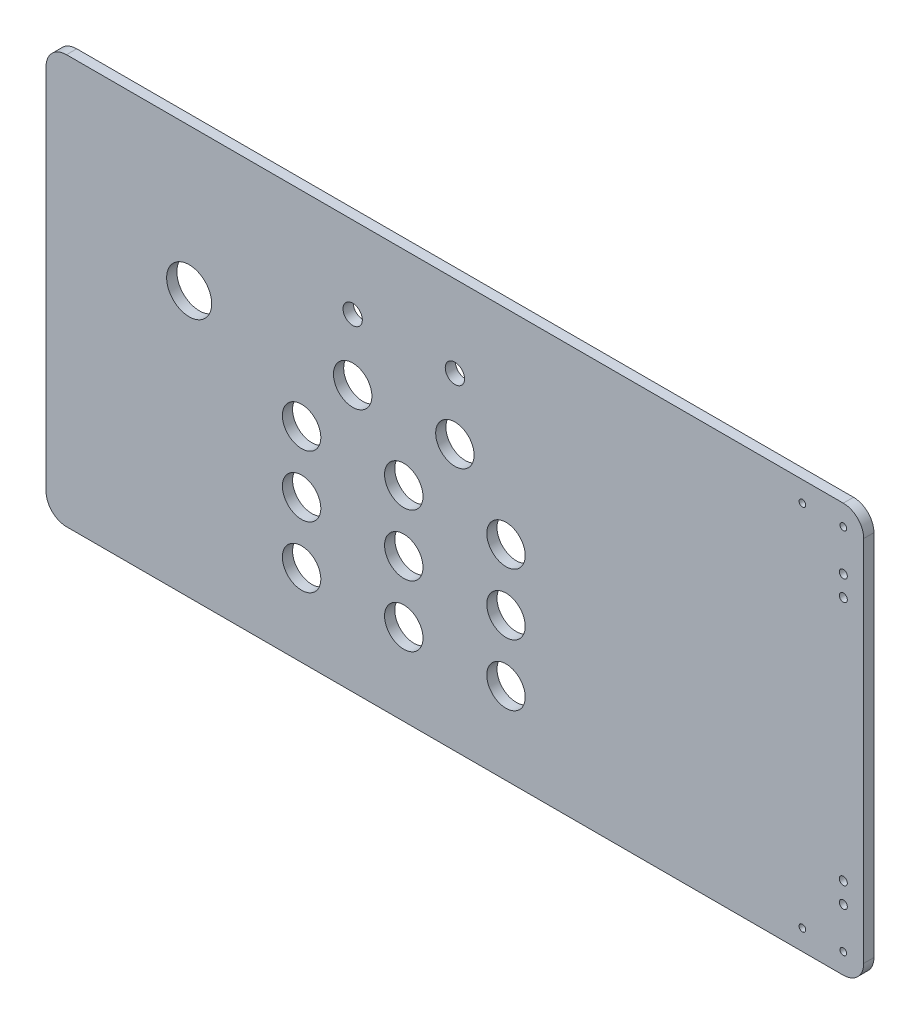
ISO-10303-21;
HEADER;
FILE_DESCRIPTION(('STEP AP214'),'2;1');
FILE_NAME('part.step','',(''),(''),'','','');
FILE_SCHEMA(('AUTOMOTIVE_DESIGN { 1 0 10303 214 1 1 1 1 }'));
ENDSEC;
DATA;
#1=APPLICATION_CONTEXT('core data for automotive mechanical design processes');
#2=APPLICATION_PROTOCOL_DEFINITION('international standard','automotive_design',2000,#1);
#3=PRODUCT_CONTEXT('',#1,'mechanical');
#4=PRODUCT('Part','Part','',(#3));
#5=PRODUCT_RELATED_PRODUCT_CATEGORY('part','',(#4));
#6=PRODUCT_DEFINITION_FORMATION('','',#4);
#7=PRODUCT_DEFINITION_CONTEXT('part definition',#1,'design');
#8=PRODUCT_DEFINITION('design','',#6,#7);
#9=PRODUCT_DEFINITION_SHAPE('','',#8);
#10=(LENGTH_UNIT() NAMED_UNIT(*) SI_UNIT(.MILLI.,.METRE.));
#11=(NAMED_UNIT(*) PLANE_ANGLE_UNIT() SI_UNIT($,.RADIAN.));
#12=(NAMED_UNIT(*) SI_UNIT($,.STERADIAN.) SOLID_ANGLE_UNIT());
#13=UNCERTAINTY_MEASURE_WITH_UNIT(LENGTH_MEASURE(1.E-05),#10,'distance_accuracy_value','');
#14=(GEOMETRIC_REPRESENTATION_CONTEXT(3) GLOBAL_UNCERTAINTY_ASSIGNED_CONTEXT((#13)) GLOBAL_UNIT_ASSIGNED_CONTEXT((#10,
#11,#12)) REPRESENTATION_CONTEXT('',''));
#15=CARTESIAN_POINT('',(0.,0.,0.));
#16=DIRECTION('',(0.,0.,1.));
#17=DIRECTION('',(1.,0.,0.));
#18=AXIS2_PLACEMENT_3D('',#15,#16,#17);
#19=CARTESIAN_POINT('',(0.,0.,6.35));
#20=DIRECTION('',(1.,0.,0.));
#21=DIRECTION('',(0.,1.,0.));
#22=AXIS2_PLACEMENT_3D('',#19,#20,#21);
#23=PLANE('',#22);
#24=DIRECTION('',(0.,-1.,0.));
#25=VECTOR('',#24,1.);
#26=CARTESIAN_POINT('',(0.,0.,0.));
#27=LINE('',#26,#25);
#28=CARTESIAN_POINT('',(-1.0547118733939E-13,241.3,0.));
#29=VERTEX_POINT('',#28);
#30=CARTESIAN_POINT('',(0.,12.7,0.));
#31=VERTEX_POINT('',#30);
#32=EDGE_CURVE('E142',#29,#31,#27,.T.);
#33=ORIENTED_EDGE('',*,*,#32,.T.);
#34=DIRECTION('',(0.,0.,-1.));
#35=VECTOR('',#34,1.);
#36=CARTESIAN_POINT('',(0.,12.7,6.35));
#37=LINE('',#36,#35);
#38=CARTESIAN_POINT('',(0.,12.7,6.35));
#39=VERTEX_POINT('',#38);
#40=EDGE_CURVE('E176',#31,#39,#37,.F.);
#41=ORIENTED_EDGE('',*,*,#40,.T.);
#42=DIRECTION('',(0.,-1.,0.));
#43=VECTOR('',#42,1.);
#44=CARTESIAN_POINT('',(0.,0.,6.35));
#45=LINE('',#44,#43);
#46=CARTESIAN_POINT('',(-1.0547118733939E-13,241.3,6.35));
#47=VERTEX_POINT('',#46);
#48=EDGE_CURVE('E140',#47,#39,#45,.T.);
#49=ORIENTED_EDGE('',*,*,#48,.F.);
#50=DIRECTION('',(0.,0.,-1.));
#51=VECTOR('',#50,1.);
#52=CARTESIAN_POINT('',(-1.0547118733939E-13,241.3,6.35));
#53=LINE('',#52,#51);
#54=EDGE_CURVE('E172',#47,#29,#53,.T.);
#55=ORIENTED_EDGE('',*,*,#54,.T.);
#56=EDGE_LOOP('',(#33,#41,#49,#55));
#57=FACE_BOUND('',#56,.T.);
#58=ADVANCED_FACE('F41',(#57),#23,.F.);
#59=CARTESIAN_POINT('',(0.,0.,6.35));
#60=DIRECTION('',(0.,1.,0.));
#61=DIRECTION('',(0.,0.,1.));
#62=AXIS2_PLACEMENT_3D('',#59,#60,#61);
#63=PLANE('',#62);
#64=DIRECTION('',(1.,0.,0.));
#65=VECTOR('',#64,1.);
#66=CARTESIAN_POINT('',(0.,0.,0.));
#67=LINE('',#66,#65);
#68=CARTESIAN_POINT('',(12.7,0.,0.));
#69=VERTEX_POINT('',#68);
#70=CARTESIAN_POINT('',(495.3,0.,0.));
#71=VERTEX_POINT('',#70);
#72=EDGE_CURVE('E136',#69,#71,#67,.T.);
#73=ORIENTED_EDGE('',*,*,#72,.T.);
#74=DIRECTION('',(0.,0.,-1.));
#75=VECTOR('',#74,1.);
#76=CARTESIAN_POINT('',(495.3,0.,6.35));
#77=LINE('',#76,#75);
#78=CARTESIAN_POINT('',(495.3,0.,6.35));
#79=VERTEX_POINT('',#78);
#80=EDGE_CURVE('E112',#71,#79,#77,.F.);
#81=ORIENTED_EDGE('',*,*,#80,.T.);
#82=DIRECTION('',(1.,0.,0.));
#83=VECTOR('',#82,1.);
#84=CARTESIAN_POINT('',(0.,0.,6.35));
#85=LINE('',#84,#83);
#86=CARTESIAN_POINT('',(12.7,0.,6.35));
#87=VERTEX_POINT('',#86);
#88=EDGE_CURVE('E195',#87,#79,#85,.T.);
#89=ORIENTED_EDGE('',*,*,#88,.F.);
#90=DIRECTION('',(0.,0.,-1.));
#91=VECTOR('',#90,1.);
#92=CARTESIAN_POINT('',(12.7,0.,6.35));
#93=LINE('',#92,#91);
#94=EDGE_CURVE('E118',#87,#69,#93,.T.);
#95=ORIENTED_EDGE('',*,*,#94,.T.);
#96=EDGE_LOOP('',(#73,#81,#89,#95));
#97=FACE_BOUND('',#96,.T.);
#98=ADVANCED_FACE('F448',(#97),#63,.F.);
#99=CARTESIAN_POINT('',(508.,0.,6.35));
#100=DIRECTION('',(-1.,0.,0.));
#101=DIRECTION('',(0.,-1.,0.));
#102=AXIS2_PLACEMENT_3D('',#99,#100,#101);
#103=PLANE('',#102);
#104=DIRECTION('',(0.,1.,0.));
#105=VECTOR('',#104,1.);
#106=CARTESIAN_POINT('',(508.,0.,6.35));
#107=LINE('',#106,#105);
#108=CARTESIAN_POINT('',(508.,12.7,6.35));
#109=VERTEX_POINT('',#108);
#110=CARTESIAN_POINT('',(508.,241.3,6.35));
#111=VERTEX_POINT('',#110);
#112=EDGE_CURVE('E127',#109,#111,#107,.T.);
#113=ORIENTED_EDGE('',*,*,#112,.F.);
#114=DIRECTION('',(0.,0.,-1.));
#115=VECTOR('',#114,1.);
#116=CARTESIAN_POINT('',(508.,12.7,6.35));
#117=LINE('',#116,#115);
#118=CARTESIAN_POINT('',(508.,12.7,0.));
#119=VERTEX_POINT('',#118);
#120=EDGE_CURVE('E111',#109,#119,#117,.T.);
#121=ORIENTED_EDGE('',*,*,#120,.T.);
#122=DIRECTION('',(0.,1.,0.));
#123=VECTOR('',#122,1.);
#124=CARTESIAN_POINT('',(508.,0.,0.));
#125=LINE('',#124,#123);
#126=CARTESIAN_POINT('',(508.,241.3,0.));
#127=VERTEX_POINT('',#126);
#128=EDGE_CURVE('E125',#119,#127,#125,.T.);
#129=ORIENTED_EDGE('',*,*,#128,.T.);
#130=DIRECTION('',(0.,0.,-1.));
#131=VECTOR('',#130,1.);
#132=CARTESIAN_POINT('',(508.,241.3,6.35));
#133=LINE('',#132,#131);
#134=EDGE_CURVE('E130',#127,#111,#133,.F.);
#135=ORIENTED_EDGE('',*,*,#134,.T.);
#136=EDGE_LOOP('',(#113,#121,#129,#135));
#137=FACE_BOUND('',#136,.T.);
#138=ADVANCED_FACE('F124',(#137),#103,.F.);
#139=CARTESIAN_POINT('',(-1.11022302462516E-13,254.,6.35));
#140=DIRECTION('',(0.,-1.,0.));
#141=DIRECTION('',(0.,0.,-1.));
#142=AXIS2_PLACEMENT_3D('',#139,#140,#141);
#143=PLANE('',#142);
#144=DIRECTION('',(-1.,0.,0.));
#145=VECTOR('',#144,1.);
#146=CARTESIAN_POINT('',(-1.11022302462516E-13,254.,0.));
#147=LINE('',#146,#145);
#148=CARTESIAN_POINT('',(495.3,254.,0.));
#149=VERTEX_POINT('',#148);
#150=CARTESIAN_POINT('',(12.6999999999999,254.,0.));
#151=VERTEX_POINT('',#150);
#152=EDGE_CURVE('E135',#149,#151,#147,.T.);
#153=ORIENTED_EDGE('',*,*,#152,.T.);
#154=DIRECTION('',(0.,0.,-1.));
#155=VECTOR('',#154,1.);
#156=CARTESIAN_POINT('',(12.6999999999999,254.,6.35));
#157=LINE('',#156,#155);
#158=CARTESIAN_POINT('',(12.6999999999999,254.,6.35));
#159=VERTEX_POINT('',#158);
#160=EDGE_CURVE('E11',#151,#159,#157,.F.);
#161=ORIENTED_EDGE('',*,*,#160,.T.);
#162=DIRECTION('',(-1.,0.,0.));
#163=VECTOR('',#162,1.);
#164=CARTESIAN_POINT('',(-1.11022302462516E-13,254.,6.35));
#165=LINE('',#164,#163);
#166=CARTESIAN_POINT('',(495.3,254.,6.35));
#167=VERTEX_POINT('',#166);
#168=EDGE_CURVE('E147',#167,#159,#165,.T.);
#169=ORIENTED_EDGE('',*,*,#168,.F.);
#170=DIRECTION('',(0.,0.,-1.));
#171=VECTOR('',#170,1.);
#172=CARTESIAN_POINT('',(495.3,254.,6.35));
#173=LINE('',#172,#171);
#174=EDGE_CURVE('E50',#167,#149,#173,.T.);
#175=ORIENTED_EDGE('',*,*,#174,.T.);
#176=EDGE_LOOP('',(#153,#161,#169,#175));
#177=FACE_BOUND('',#176,.T.);
#178=ADVANCED_FACE('F181',(#177),#143,.F.);
#179=CARTESIAN_POINT('',(0.,0.,6.35));
#180=DIRECTION('',(0.,0.,-1.));
#181=DIRECTION('',(-1.,0.,0.));
#182=AXIS2_PLACEMENT_3D('',#179,#180,#181);
#183=PLANE('',#182);
#184=CARTESIAN_POINT('',(469.920545375963,241.3,6.35));
#185=DIRECTION('',(0.,0.,-1.));
#186=DIRECTION('',(-1.,0.,0.));
#187=AXIS2_PLACEMENT_3D('',#184,#185,#186);
#188=CIRCLE('',#187,2.07010000000004);
#189=CARTESIAN_POINT('',(467.850445375963,241.3,6.35));
#190=VERTEX_POINT('',#189);
#191=EDGE_CURVE('E325',#190,#190,#188,.T.);
#192=ORIENTED_EDGE('',*,*,#191,.T.);
#193=EDGE_LOOP('',(#192));
#194=FACE_BOUND('',#193,.T.);
#195=CARTESIAN_POINT('',(469.920545375963,12.7,6.35));
#196=DIRECTION('',(0.,0.,-1.));
#197=DIRECTION('',(1.,0.,0.));
#198=AXIS2_PLACEMENT_3D('',#195,#196,#197);
#199=CIRCLE('',#198,2.07010000000004);
#200=CARTESIAN_POINT('',(471.990645375963,12.7,6.35));
#201=VERTEX_POINT('',#200);
#202=EDGE_CURVE('E350',#201,#201,#199,.T.);
#203=ORIENTED_EDGE('',*,*,#202,.T.);
#204=EDGE_LOOP('',(#203));
#205=FACE_BOUND('',#204,.T.);
#206=CARTESIAN_POINT('',(495.320545375963,215.9,6.35));
#207=DIRECTION('',(0.,0.,-1.));
#208=DIRECTION('',(-1.,0.,0.));
#209=AXIS2_PLACEMENT_3D('',#206,#207,#208);
#210=CIRCLE('',#209,2.48919999999925);
#211=CARTESIAN_POINT('',(492.831345375963,215.9,6.35));
#212=VERTEX_POINT('',#211);
#213=EDGE_CURVE('E342',#212,#212,#210,.T.);
#214=ORIENTED_EDGE('',*,*,#213,.T.);
#215=EDGE_LOOP('',(#214));
#216=FACE_BOUND('',#215,.T.);
#217=CARTESIAN_POINT('',(495.320545375963,203.2,6.35));
#218=DIRECTION('',(0.,0.,-1.));
#219=DIRECTION('',(-1.,0.,0.));
#220=AXIS2_PLACEMENT_3D('',#217,#218,#219);
#221=CIRCLE('',#220,2.48919999999959);
#222=CARTESIAN_POINT('',(492.831345375963,203.2,6.35));
#223=VERTEX_POINT('',#222);
#224=EDGE_CURVE('E333',#223,#223,#221,.T.);
#225=ORIENTED_EDGE('',*,*,#224,.T.);
#226=EDGE_LOOP('',(#225));
#227=FACE_BOUND('',#226,.T.);
#228=CARTESIAN_POINT('',(495.320545375963,50.7999999999998,6.35));
#229=DIRECTION('',(0.,0.,-1.));
#230=DIRECTION('',(1.,0.,0.));
#231=AXIS2_PLACEMENT_3D('',#228,#229,#230);
#232=CIRCLE('',#231,2.48919999999959);
#233=CARTESIAN_POINT('',(497.809745375962,50.7999999999998,6.35));
#234=VERTEX_POINT('',#233);
#235=EDGE_CURVE('E334',#234,#234,#232,.T.);
#236=ORIENTED_EDGE('',*,*,#235,.T.);
#237=EDGE_LOOP('',(#236));
#238=FACE_BOUND('',#237,.T.);
#239=CARTESIAN_POINT('',(495.320545375963,38.0999999999998,6.35));
#240=DIRECTION('',(0.,0.,-1.));
#241=DIRECTION('',(1.,0.,0.));
#242=AXIS2_PLACEMENT_3D('',#239,#240,#241);
#243=CIRCLE('',#242,2.48919999999925);
#244=CARTESIAN_POINT('',(497.809745375962,38.0999999999998,6.35));
#245=VERTEX_POINT('',#244);
#246=EDGE_CURVE('E373',#245,#245,#243,.T.);
#247=ORIENTED_EDGE('',*,*,#246,.T.);
#248=EDGE_LOOP('',(#247));
#249=FACE_BOUND('',#248,.T.);
#250=CARTESIAN_POINT('',(495.320545375963,12.7,6.35));
#251=DIRECTION('',(0.,0.,-1.));
#252=DIRECTION('',(1.,0.,0.));
#253=AXIS2_PLACEMENT_3D('',#250,#251,#252);
#254=CIRCLE('',#253,2.07010000000004);
#255=CARTESIAN_POINT('',(497.390645375963,12.7,6.35));
#256=VERTEX_POINT('',#255);
#257=EDGE_CURVE('E365',#256,#256,#254,.T.);
#258=ORIENTED_EDGE('',*,*,#257,.T.);
#259=EDGE_LOOP('',(#258));
#260=FACE_BOUND('',#259,.T.);
#261=CARTESIAN_POINT('',(495.320545375963,241.3,6.35));
#262=DIRECTION('',(0.,0.,-1.));
#263=DIRECTION('',(-1.,0.,0.));
#264=AXIS2_PLACEMENT_3D('',#261,#262,#263);
#265=CIRCLE('',#264,2.07010000000004);
#266=CARTESIAN_POINT('',(493.250445375963,241.3,6.35));
#267=VERTEX_POINT('',#266);
#268=EDGE_CURVE('E286',#267,#267,#265,.T.);
#269=ORIENTED_EDGE('',*,*,#268,.T.);
#270=EDGE_LOOP('',(#269));
#271=FACE_BOUND('',#270,.T.);
#272=CARTESIAN_POINT('',(222.25,50.8,6.35));
#273=DIRECTION('',(0.,0.,-1.));
#274=DIRECTION('',(-1.,0.,0.));
#275=AXIS2_PLACEMENT_3D('',#272,#273,#274);
#276=CIRCLE('',#275,11.938);
#277=CARTESIAN_POINT('',(210.312,50.8,6.35));
#278=VERTEX_POINT('',#277);
#279=EDGE_CURVE('E249',#278,#278,#276,.T.);
#280=ORIENTED_EDGE('',*,*,#279,.T.);
#281=EDGE_LOOP('',(#280));
#282=FACE_BOUND('',#281,.T.);
#283=CARTESIAN_POINT('',(158.75,50.8,6.35));
#284=DIRECTION('',(0.,0.,-1.));
#285=DIRECTION('',(-1.,0.,0.));
#286=AXIS2_PLACEMENT_3D('',#283,#284,#285);
#287=CIRCLE('',#286,11.938);
#288=CARTESIAN_POINT('',(146.812,50.8,6.35));
#289=VERTEX_POINT('',#288);
#290=EDGE_CURVE('E258',#289,#289,#287,.T.);
#291=ORIENTED_EDGE('',*,*,#290,.T.);
#292=EDGE_LOOP('',(#291));
#293=FACE_BOUND('',#292,.T.);
#294=CARTESIAN_POINT('',(190.5,165.1,6.35));
#295=DIRECTION('',(0.,0.,-1.));
#296=DIRECTION('',(-1.,0.,0.));
#297=AXIS2_PLACEMENT_3D('',#294,#295,#296);
#298=CIRCLE('',#297,11.938);
#299=CARTESIAN_POINT('',(178.562,165.1,6.35));
#300=VERTEX_POINT('',#299);
#301=EDGE_CURVE('E266',#300,#300,#298,.T.);
#302=ORIENTED_EDGE('',*,*,#301,.T.);
#303=EDGE_LOOP('',(#302));
#304=FACE_BOUND('',#303,.T.);
#305=CARTESIAN_POINT('',(158.75,88.8999999999998,6.35));
#306=DIRECTION('',(0.,0.,-1.));
#307=DIRECTION('',(-1.,0.,0.));
#308=AXIS2_PLACEMENT_3D('',#305,#306,#307);
#309=CIRCLE('',#308,11.938);
#310=CARTESIAN_POINT('',(146.812,88.8999999999998,6.35));
#311=VERTEX_POINT('',#310);
#312=EDGE_CURVE('E274',#311,#311,#309,.T.);
#313=ORIENTED_EDGE('',*,*,#312,.T.);
#314=EDGE_LOOP('',(#313));
#315=FACE_BOUND('',#314,.T.);
#316=CARTESIAN_POINT('',(222.25,88.8999999999998,6.35));
#317=DIRECTION('',(0.,0.,-1.));
#318=DIRECTION('',(-1.,0.,0.));
#319=AXIS2_PLACEMENT_3D('',#316,#317,#318);
#320=CIRCLE('',#319,11.938);
#321=CARTESIAN_POINT('',(210.312,88.8999999999998,6.35));
#322=VERTEX_POINT('',#321);
#323=EDGE_CURVE('E217',#322,#322,#320,.T.);
#324=ORIENTED_EDGE('',*,*,#323,.T.);
#325=EDGE_LOOP('',(#324));
#326=FACE_BOUND('',#325,.T.);
#327=CARTESIAN_POINT('',(254.,165.1,6.35));
#328=DIRECTION('',(0.,0.,-1.));
#329=DIRECTION('',(-1.,0.,0.));
#330=AXIS2_PLACEMENT_3D('',#327,#328,#329);
#331=CIRCLE('',#330,11.938);
#332=CARTESIAN_POINT('',(242.062,165.1,6.35));
#333=VERTEX_POINT('',#332);
#334=EDGE_CURVE('E226',#333,#333,#331,.T.);
#335=ORIENTED_EDGE('',*,*,#334,.T.);
#336=EDGE_LOOP('',(#335));
#337=FACE_BOUND('',#336,.T.);
#338=CARTESIAN_POINT('',(285.75,127.,6.35));
#339=DIRECTION('',(0.,0.,-1.));
#340=DIRECTION('',(-1.,0.,0.));
#341=AXIS2_PLACEMENT_3D('',#338,#339,#340);
#342=CIRCLE('',#341,11.938);
#343=CARTESIAN_POINT('',(273.812,127.,6.35));
#344=VERTEX_POINT('',#343);
#345=EDGE_CURVE('E234',#344,#344,#342,.T.);
#346=ORIENTED_EDGE('',*,*,#345,.T.);
#347=EDGE_LOOP('',(#346));
#348=FACE_BOUND('',#347,.T.);
#349=CARTESIAN_POINT('',(285.75,88.8999999999998,6.35));
#350=DIRECTION('',(0.,0.,-1.));
#351=DIRECTION('',(-1.,0.,0.));
#352=AXIS2_PLACEMENT_3D('',#349,#350,#351);
#353=CIRCLE('',#352,11.938);
#354=CARTESIAN_POINT('',(273.812,88.8999999999998,6.35));
#355=VERTEX_POINT('',#354);
#356=EDGE_CURVE('E242',#355,#355,#353,.T.);
#357=ORIENTED_EDGE('',*,*,#356,.T.);
#358=EDGE_LOOP('',(#357));
#359=FACE_BOUND('',#358,.T.);
#360=CARTESIAN_POINT('',(222.25,127.,6.35));
#361=DIRECTION('',(0.,0.,-1.));
#362=DIRECTION('',(-1.,0.,0.));
#363=AXIS2_PLACEMENT_3D('',#360,#361,#362);
#364=CIRCLE('',#363,11.938);
#365=CARTESIAN_POINT('',(210.312,127.,6.35));
#366=VERTEX_POINT('',#365);
#367=EDGE_CURVE('E314',#366,#366,#364,.T.);
#368=ORIENTED_EDGE('',*,*,#367,.T.);
#369=EDGE_LOOP('',(#368));
#370=FACE_BOUND('',#369,.T.);
#371=CARTESIAN_POINT('',(158.75,127.,6.35));
#372=DIRECTION('',(0.,0.,-1.));
#373=DIRECTION('',(-1.,0.,0.));
#374=AXIS2_PLACEMENT_3D('',#371,#372,#373);
#375=CIRCLE('',#374,11.938);
#376=CARTESIAN_POINT('',(146.812,127.,6.35));
#377=VERTEX_POINT('',#376);
#378=EDGE_CURVE('E306',#377,#377,#375,.T.);
#379=ORIENTED_EDGE('',*,*,#378,.T.);
#380=EDGE_LOOP('',(#379));
#381=FACE_BOUND('',#380,.T.);
#382=CARTESIAN_POINT('',(88.8999999999999,165.1,6.35));
#383=DIRECTION('',(0.,0.,-1.));
#384=DIRECTION('',(-1.,0.,0.));
#385=AXIS2_PLACEMENT_3D('',#382,#383,#384);
#386=CIRCLE('',#385,14.);
#387=CARTESIAN_POINT('',(74.8999999999999,165.1,6.35));
#388=VERTEX_POINT('',#387);
#389=EDGE_CURVE('E298',#388,#388,#386,.T.);
#390=ORIENTED_EDGE('',*,*,#389,.T.);
#391=EDGE_LOOP('',(#390));
#392=FACE_BOUND('',#391,.T.);
#393=CARTESIAN_POINT('',(190.5,203.2,6.35));
#394=DIRECTION('',(0.,0.,-1.));
#395=DIRECTION('',(-1.,0.,0.));
#396=AXIS2_PLACEMENT_3D('',#393,#394,#395);
#397=CIRCLE('',#396,6.00000000000002);
#398=CARTESIAN_POINT('',(184.5,203.2,6.35));
#399=VERTEX_POINT('',#398);
#400=EDGE_CURVE('E290',#399,#399,#397,.T.);
#401=ORIENTED_EDGE('',*,*,#400,.T.);
#402=EDGE_LOOP('',(#401));
#403=FACE_BOUND('',#402,.T.);
#404=CARTESIAN_POINT('',(254.,203.2,6.35));
#405=DIRECTION('',(0.,0.,-1.));
#406=DIRECTION('',(-1.,0.,0.));
#407=AXIS2_PLACEMENT_3D('',#404,#405,#406);
#408=CIRCLE('',#407,6.00000000000002);
#409=CARTESIAN_POINT('',(248.,203.2,6.35));
#410=VERTEX_POINT('',#409);
#411=EDGE_CURVE('E281',#410,#410,#408,.T.);
#412=ORIENTED_EDGE('',*,*,#411,.T.);
#413=EDGE_LOOP('',(#412));
#414=FACE_BOUND('',#413,.T.);
#415=CARTESIAN_POINT('',(285.75,50.8,6.35));
#416=DIRECTION('',(0.,0.,-1.));
#417=DIRECTION('',(-1.,0.,0.));
#418=AXIS2_PLACEMENT_3D('',#415,#416,#417);
#419=CIRCLE('',#418,11.938);
#420=CARTESIAN_POINT('',(273.812,50.8,6.35));
#421=VERTEX_POINT('',#420);
#422=EDGE_CURVE('E208',#421,#421,#419,.T.);
#423=ORIENTED_EDGE('',*,*,#422,.T.);
#424=EDGE_LOOP('',(#423));
#425=FACE_BOUND('',#424,.T.);
#426=ORIENTED_EDGE('',*,*,#88,.T.);
#427=CARTESIAN_POINT('',(495.3,12.7,6.35));
#428=DIRECTION('',(0.,0.,-1.));
#429=DIRECTION('',(-1.,0.,0.));
#430=AXIS2_PLACEMENT_3D('',#427,#428,#429);
#431=CIRCLE('',#430,12.7);
#432=EDGE_CURVE('E169',#79,#109,#431,.F.);
#433=ORIENTED_EDGE('',*,*,#432,.T.);
#434=ORIENTED_EDGE('',*,*,#112,.T.);
#435=CARTESIAN_POINT('',(495.3,241.3,6.35));
#436=DIRECTION('',(0.,0.,-1.));
#437=DIRECTION('',(-1.,0.,0.));
#438=AXIS2_PLACEMENT_3D('',#435,#436,#437);
#439=CIRCLE('',#438,12.7);
#440=EDGE_CURVE('E62',#111,#167,#439,.F.);
#441=ORIENTED_EDGE('',*,*,#440,.T.);
#442=ORIENTED_EDGE('',*,*,#168,.T.);
#443=CARTESIAN_POINT('',(12.6999999999999,241.3,6.35));
#444=DIRECTION('',(0.,0.,-1.));
#445=DIRECTION('',(-1.,0.,0.));
#446=AXIS2_PLACEMENT_3D('',#443,#444,#445);
#447=CIRCLE('',#446,12.7);
#448=EDGE_CURVE('E163',#159,#47,#447,.F.);
#449=ORIENTED_EDGE('',*,*,#448,.T.);
#450=ORIENTED_EDGE('',*,*,#48,.T.);
#451=CARTESIAN_POINT('',(12.7,12.7,6.35));
#452=DIRECTION('',(0.,0.,-1.));
#453=DIRECTION('',(-1.,0.,0.));
#454=AXIS2_PLACEMENT_3D('',#451,#452,#453);
#455=CIRCLE('',#454,12.7);
#456=EDGE_CURVE('E166',#39,#87,#455,.F.);
#457=ORIENTED_EDGE('',*,*,#456,.T.);
#458=EDGE_LOOP('',(#426,#433,#434,#441,#442,#449,#450,#457));
#459=FACE_BOUND('',#458,.T.);
#460=ADVANCED_FACE('F385',(#194,#205,#216,#227,#238,#249,#260,#271,#282,#293,#304,#315,#326,
#337,#348,#359,#370,#381,#392,#403,#414,#425,#459),#183,.F.);
#461=CARTESIAN_POINT('',(0.,0.,0.));
#462=DIRECTION('',(0.,0.,-1.));
#463=DIRECTION('',(-1.,0.,0.));
#464=AXIS2_PLACEMENT_3D('',#461,#462,#463);
#465=PLANE('',#464);
#466=CARTESIAN_POINT('',(469.920545375963,241.3,0.));
#467=DIRECTION('',(0.,0.,-1.));
#468=DIRECTION('',(-1.,0.,0.));
#469=AXIS2_PLACEMENT_3D('',#466,#467,#468);
#470=CIRCLE('',#469,2.07010000000004);
#471=CARTESIAN_POINT('',(467.850445375963,241.3,0.));
#472=VERTEX_POINT('',#471);
#473=EDGE_CURVE('E354',#472,#472,#470,.T.);
#474=ORIENTED_EDGE('',*,*,#473,.F.);
#475=EDGE_LOOP('',(#474));
#476=FACE_BOUND('',#475,.T.);
#477=CARTESIAN_POINT('',(469.920545375963,12.7,0.));
#478=DIRECTION('',(0.,0.,-1.));
#479=DIRECTION('',(1.,0.,0.));
#480=AXIS2_PLACEMENT_3D('',#477,#478,#479);
#481=CIRCLE('',#480,2.07010000000004);
#482=CARTESIAN_POINT('',(471.990645375963,12.7,0.));
#483=VERTEX_POINT('',#482);
#484=EDGE_CURVE('E346',#483,#483,#481,.T.);
#485=ORIENTED_EDGE('',*,*,#484,.F.);
#486=EDGE_LOOP('',(#485));
#487=FACE_BOUND('',#486,.T.);
#488=CARTESIAN_POINT('',(495.320545375963,215.9,0.));
#489=DIRECTION('',(0.,0.,-1.));
#490=DIRECTION('',(-1.,0.,0.));
#491=AXIS2_PLACEMENT_3D('',#488,#489,#490);
#492=CIRCLE('',#491,2.48919999999925);
#493=CARTESIAN_POINT('',(492.831345375963,215.9,0.));
#494=VERTEX_POINT('',#493);
#495=EDGE_CURVE('E338',#494,#494,#492,.T.);
#496=ORIENTED_EDGE('',*,*,#495,.F.);
#497=EDGE_LOOP('',(#496));
#498=FACE_BOUND('',#497,.T.);
#499=CARTESIAN_POINT('',(495.320545375963,203.2,0.));
#500=DIRECTION('',(0.,0.,-1.));
#501=DIRECTION('',(-1.,0.,0.));
#502=AXIS2_PLACEMENT_3D('',#499,#500,#501);
#503=CIRCLE('',#502,2.48919999999959);
#504=CARTESIAN_POINT('',(492.831345375963,203.2,0.));
#505=VERTEX_POINT('',#504);
#506=EDGE_CURVE('E329',#505,#505,#503,.T.);
#507=ORIENTED_EDGE('',*,*,#506,.F.);
#508=EDGE_LOOP('',(#507));
#509=FACE_BOUND('',#508,.T.);
#510=CARTESIAN_POINT('',(495.320545375963,50.7999999999998,0.));
#511=DIRECTION('',(0.,0.,-1.));
#512=DIRECTION('',(1.,0.,0.));
#513=AXIS2_PLACEMENT_3D('',#510,#511,#512);
#514=CIRCLE('',#513,2.48919999999959);
#515=CARTESIAN_POINT('',(497.809745375962,50.7999999999998,0.));
#516=VERTEX_POINT('',#515);
#517=EDGE_CURVE('E377',#516,#516,#514,.T.);
#518=ORIENTED_EDGE('',*,*,#517,.F.);
#519=EDGE_LOOP('',(#518));
#520=FACE_BOUND('',#519,.T.);
#521=CARTESIAN_POINT('',(495.320545375963,38.0999999999998,0.));
#522=DIRECTION('',(0.,0.,-1.));
#523=DIRECTION('',(1.,0.,0.));
#524=AXIS2_PLACEMENT_3D('',#521,#522,#523);
#525=CIRCLE('',#524,2.48919999999925);
#526=CARTESIAN_POINT('',(497.809745375962,38.0999999999998,0.));
#527=VERTEX_POINT('',#526);
#528=EDGE_CURVE('E369',#527,#527,#525,.T.);
#529=ORIENTED_EDGE('',*,*,#528,.F.);
#530=EDGE_LOOP('',(#529));
#531=FACE_BOUND('',#530,.T.);
#532=CARTESIAN_POINT('',(495.320545375963,12.7,0.));
#533=DIRECTION('',(0.,0.,-1.));
#534=DIRECTION('',(1.,0.,0.));
#535=AXIS2_PLACEMENT_3D('',#532,#533,#534);
#536=CIRCLE('',#535,2.07010000000004);
#537=CARTESIAN_POINT('',(497.390645375963,12.7,0.));
#538=VERTEX_POINT('',#537);
#539=EDGE_CURVE('E361',#538,#538,#536,.T.);
#540=ORIENTED_EDGE('',*,*,#539,.F.);
#541=EDGE_LOOP('',(#540));
#542=FACE_BOUND('',#541,.T.);
#543=CARTESIAN_POINT('',(495.320545375963,241.3,0.));
#544=DIRECTION('',(0.,0.,-1.));
#545=DIRECTION('',(-1.,0.,0.));
#546=AXIS2_PLACEMENT_3D('',#543,#544,#545);
#547=CIRCLE('',#546,2.07010000000004);
#548=CARTESIAN_POINT('',(493.250445375963,241.3,0.));
#549=VERTEX_POINT('',#548);
#550=EDGE_CURVE('E321',#549,#549,#547,.T.);
#551=ORIENTED_EDGE('',*,*,#550,.F.);
#552=EDGE_LOOP('',(#551));
#553=FACE_BOUND('',#552,.T.);
#554=CARTESIAN_POINT('',(222.25,50.8,0.));
#555=DIRECTION('',(0.,0.,-1.));
#556=DIRECTION('',(-1.,0.,0.));
#557=AXIS2_PLACEMENT_3D('',#554,#555,#556);
#558=CIRCLE('',#557,11.938);
#559=CARTESIAN_POINT('',(210.312,50.8,0.));
#560=VERTEX_POINT('',#559);
#561=EDGE_CURVE('E253',#560,#560,#558,.T.);
#562=ORIENTED_EDGE('',*,*,#561,.F.);
#563=EDGE_LOOP('',(#562));
#564=FACE_BOUND('',#563,.T.);
#565=CARTESIAN_POINT('',(158.75,50.8,0.));
#566=DIRECTION('',(0.,0.,-1.));
#567=DIRECTION('',(-1.,0.,0.));
#568=AXIS2_PLACEMENT_3D('',#565,#566,#567);
#569=CIRCLE('',#568,11.938);
#570=CARTESIAN_POINT('',(146.812,50.8,0.));
#571=VERTEX_POINT('',#570);
#572=EDGE_CURVE('E262',#571,#571,#569,.T.);
#573=ORIENTED_EDGE('',*,*,#572,.F.);
#574=EDGE_LOOP('',(#573));
#575=FACE_BOUND('',#574,.T.);
#576=CARTESIAN_POINT('',(190.5,165.1,0.));
#577=DIRECTION('',(0.,0.,-1.));
#578=DIRECTION('',(-1.,0.,0.));
#579=AXIS2_PLACEMENT_3D('',#576,#577,#578);
#580=CIRCLE('',#579,11.938);
#581=CARTESIAN_POINT('',(178.562,165.1,0.));
#582=VERTEX_POINT('',#581);
#583=EDGE_CURVE('E270',#582,#582,#580,.T.);
#584=ORIENTED_EDGE('',*,*,#583,.F.);
#585=EDGE_LOOP('',(#584));
#586=FACE_BOUND('',#585,.T.);
#587=CARTESIAN_POINT('',(158.75,88.8999999999998,0.));
#588=DIRECTION('',(0.,0.,-1.));
#589=DIRECTION('',(-1.,0.,0.));
#590=AXIS2_PLACEMENT_3D('',#587,#588,#589);
#591=CIRCLE('',#590,11.938);
#592=CARTESIAN_POINT('',(146.812,88.8999999999998,0.));
#593=VERTEX_POINT('',#592);
#594=EDGE_CURVE('E222',#593,#593,#591,.T.);
#595=ORIENTED_EDGE('',*,*,#594,.F.);
#596=EDGE_LOOP('',(#595));
#597=FACE_BOUND('',#596,.T.);
#598=CARTESIAN_POINT('',(222.25,88.8999999999998,0.));
#599=DIRECTION('',(0.,0.,-1.));
#600=DIRECTION('',(-1.,0.,0.));
#601=AXIS2_PLACEMENT_3D('',#598,#599,#600);
#602=CIRCLE('',#601,11.938);
#603=CARTESIAN_POINT('',(210.312,88.8999999999998,0.));
#604=VERTEX_POINT('',#603);
#605=EDGE_CURVE('E221',#604,#604,#602,.T.);
#606=ORIENTED_EDGE('',*,*,#605,.F.);
#607=EDGE_LOOP('',(#606));
#608=FACE_BOUND('',#607,.T.);
#609=CARTESIAN_POINT('',(254.,165.1,0.));
#610=DIRECTION('',(0.,0.,-1.));
#611=DIRECTION('',(-1.,0.,0.));
#612=AXIS2_PLACEMENT_3D('',#609,#610,#611);
#613=CIRCLE('',#612,11.938);
#614=CARTESIAN_POINT('',(242.062,165.1,0.));
#615=VERTEX_POINT('',#614);
#616=EDGE_CURVE('E230',#615,#615,#613,.T.);
#617=ORIENTED_EDGE('',*,*,#616,.F.);
#618=EDGE_LOOP('',(#617));
#619=FACE_BOUND('',#618,.T.);
#620=CARTESIAN_POINT('',(285.75,127.,0.));
#621=DIRECTION('',(0.,0.,-1.));
#622=DIRECTION('',(-1.,0.,0.));
#623=AXIS2_PLACEMENT_3D('',#620,#621,#622);
#624=CIRCLE('',#623,11.938);
#625=CARTESIAN_POINT('',(273.812,127.,0.));
#626=VERTEX_POINT('',#625);
#627=EDGE_CURVE('E238',#626,#626,#624,.T.);
#628=ORIENTED_EDGE('',*,*,#627,.F.);
#629=EDGE_LOOP('',(#628));
#630=FACE_BOUND('',#629,.T.);
#631=CARTESIAN_POINT('',(285.75,88.8999999999998,0.));
#632=DIRECTION('',(0.,0.,-1.));
#633=DIRECTION('',(-1.,0.,0.));
#634=AXIS2_PLACEMENT_3D('',#631,#632,#633);
#635=CIRCLE('',#634,11.938);
#636=CARTESIAN_POINT('',(273.812,88.8999999999998,0.));
#637=VERTEX_POINT('',#636);
#638=EDGE_CURVE('E215',#637,#637,#635,.T.);
#639=ORIENTED_EDGE('',*,*,#638,.F.);
#640=EDGE_LOOP('',(#639));
#641=FACE_BOUND('',#640,.T.);
#642=CARTESIAN_POINT('',(222.25,127.,0.));
#643=DIRECTION('',(0.,0.,-1.));
#644=DIRECTION('',(-1.,0.,0.));
#645=AXIS2_PLACEMENT_3D('',#642,#643,#644);
#646=CIRCLE('',#645,11.938);
#647=CARTESIAN_POINT('',(210.312,127.,0.));
#648=VERTEX_POINT('',#647);
#649=EDGE_CURVE('E254',#648,#648,#646,.T.);
#650=ORIENTED_EDGE('',*,*,#649,.F.);
#651=EDGE_LOOP('',(#650));
#652=FACE_BOUND('',#651,.T.);
#653=CARTESIAN_POINT('',(158.75,127.,0.));
#654=DIRECTION('',(0.,0.,-1.));
#655=DIRECTION('',(-1.,0.,0.));
#656=AXIS2_PLACEMENT_3D('',#653,#654,#655);
#657=CIRCLE('',#656,11.938);
#658=CARTESIAN_POINT('',(146.812,127.,0.));
#659=VERTEX_POINT('',#658);
#660=EDGE_CURVE('E310',#659,#659,#657,.T.);
#661=ORIENTED_EDGE('',*,*,#660,.F.);
#662=EDGE_LOOP('',(#661));
#663=FACE_BOUND('',#662,.T.);
#664=CARTESIAN_POINT('',(88.8999999999999,165.1,0.));
#665=DIRECTION('',(0.,0.,-1.));
#666=DIRECTION('',(-1.,0.,0.));
#667=AXIS2_PLACEMENT_3D('',#664,#665,#666);
#668=CIRCLE('',#667,14.);
#669=CARTESIAN_POINT('',(74.8999999999999,165.1,0.));
#670=VERTEX_POINT('',#669);
#671=EDGE_CURVE('E302',#670,#670,#668,.T.);
#672=ORIENTED_EDGE('',*,*,#671,.F.);
#673=EDGE_LOOP('',(#672));
#674=FACE_BOUND('',#673,.T.);
#675=CARTESIAN_POINT('',(190.5,203.2,0.));
#676=DIRECTION('',(0.,0.,-1.));
#677=DIRECTION('',(-1.,0.,0.));
#678=AXIS2_PLACEMENT_3D('',#675,#676,#677);
#679=CIRCLE('',#678,6.00000000000002);
#680=CARTESIAN_POINT('',(184.5,203.2,0.));
#681=VERTEX_POINT('',#680);
#682=EDGE_CURVE('E294',#681,#681,#679,.T.);
#683=ORIENTED_EDGE('',*,*,#682,.F.);
#684=EDGE_LOOP('',(#683));
#685=FACE_BOUND('',#684,.T.);
#686=CARTESIAN_POINT('',(254.,203.2,0.));
#687=DIRECTION('',(0.,0.,-1.));
#688=DIRECTION('',(-1.,0.,0.));
#689=AXIS2_PLACEMENT_3D('',#686,#687,#688);
#690=CIRCLE('',#689,6.00000000000002);
#691=CARTESIAN_POINT('',(248.,203.2,0.));
#692=VERTEX_POINT('',#691);
#693=EDGE_CURVE('E285',#692,#692,#690,.T.);
#694=ORIENTED_EDGE('',*,*,#693,.F.);
#695=EDGE_LOOP('',(#694));
#696=FACE_BOUND('',#695,.T.);
#697=CARTESIAN_POINT('',(285.75,50.8,0.));
#698=DIRECTION('',(0.,0.,-1.));
#699=DIRECTION('',(-1.,0.,0.));
#700=AXIS2_PLACEMENT_3D('',#697,#698,#699);
#701=CIRCLE('',#700,11.938);
#702=CARTESIAN_POINT('',(273.812,50.8,0.));
#703=VERTEX_POINT('',#702);
#704=EDGE_CURVE('E201',#703,#703,#701,.T.);
#705=ORIENTED_EDGE('',*,*,#704,.F.);
#706=EDGE_LOOP('',(#705));
#707=FACE_BOUND('',#706,.T.);
#708=ORIENTED_EDGE('',*,*,#128,.F.);
#709=CARTESIAN_POINT('',(495.3,12.7,0.));
#710=DIRECTION('',(0.,0.,-1.));
#711=DIRECTION('',(-1.,0.,0.));
#712=AXIS2_PLACEMENT_3D('',#709,#710,#711);
#713=CIRCLE('',#712,12.7);
#714=EDGE_CURVE('E107',#119,#71,#713,.T.);
#715=ORIENTED_EDGE('',*,*,#714,.T.);
#716=ORIENTED_EDGE('',*,*,#72,.F.);
#717=CARTESIAN_POINT('',(12.7,12.7,0.));
#718=DIRECTION('',(0.,0.,-1.));
#719=DIRECTION('',(-1.,0.,0.));
#720=AXIS2_PLACEMENT_3D('',#717,#718,#719);
#721=CIRCLE('',#720,12.7);
#722=EDGE_CURVE('E119',#69,#31,#721,.T.);
#723=ORIENTED_EDGE('',*,*,#722,.T.);
#724=ORIENTED_EDGE('',*,*,#32,.F.);
#725=CARTESIAN_POINT('',(12.6999999999999,241.3,0.));
#726=DIRECTION('',(0.,0.,-1.));
#727=DIRECTION('',(-1.,0.,0.));
#728=AXIS2_PLACEMENT_3D('',#725,#726,#727);
#729=CIRCLE('',#728,12.7);
#730=EDGE_CURVE('E151',#29,#151,#729,.T.);
#731=ORIENTED_EDGE('',*,*,#730,.T.);
#732=ORIENTED_EDGE('',*,*,#152,.F.);
#733=CARTESIAN_POINT('',(495.3,241.3,0.));
#734=DIRECTION('',(0.,0.,-1.));
#735=DIRECTION('',(-1.,0.,0.));
#736=AXIS2_PLACEMENT_3D('',#733,#734,#735);
#737=CIRCLE('',#736,12.7);
#738=EDGE_CURVE('E129',#149,#127,#737,.T.);
#739=ORIENTED_EDGE('',*,*,#738,.T.);
#740=EDGE_LOOP('',(#708,#715,#716,#723,#724,#731,#732,#739));
#741=FACE_BOUND('',#740,.T.);
#742=ADVANCED_FACE('F132',(#476,#487,#498,#509,#520,#531,#542,#553,#564,#575,#586,#597,#608,
#619,#630,#641,#652,#663,#674,#685,#696,#707,#741),#465,.T.);
#743=CARTESIAN_POINT('',(285.75,50.8,6.35));
#744=DIRECTION('',(0.,0.,-1.));
#745=DIRECTION('',(-1.,0.,0.));
#746=AXIS2_PLACEMENT_3D('',#743,#744,#745);
#747=CYLINDRICAL_SURFACE('',#746,11.938);
#748=ORIENTED_EDGE('',*,*,#422,.F.);
#749=EDGE_LOOP('',(#748));
#750=FACE_BOUND('',#749,.T.);
#751=ORIENTED_EDGE('',*,*,#704,.T.);
#752=EDGE_LOOP('',(#751));
#753=FACE_BOUND('',#752,.T.);
#754=ADVANCED_FACE('F398',(#750,#753),#747,.F.);
#755=CARTESIAN_POINT('',(254.,203.2,6.35));
#756=DIRECTION('',(0.,0.,-1.));
#757=DIRECTION('',(-1.,0.,0.));
#758=AXIS2_PLACEMENT_3D('',#755,#756,#757);
#759=CYLINDRICAL_SURFACE('',#758,6.00000000000002);
#760=ORIENTED_EDGE('',*,*,#411,.F.);
#761=EDGE_LOOP('',(#760));
#762=FACE_BOUND('',#761,.T.);
#763=ORIENTED_EDGE('',*,*,#693,.T.);
#764=EDGE_LOOP('',(#763));
#765=FACE_BOUND('',#764,.T.);
#766=ADVANCED_FACE('F436',(#762,#765),#759,.F.);
#767=CARTESIAN_POINT('',(190.5,203.2,6.35));
#768=DIRECTION('',(0.,0.,-1.));
#769=DIRECTION('',(-1.,0.,0.));
#770=AXIS2_PLACEMENT_3D('',#767,#768,#769);
#771=CYLINDRICAL_SURFACE('',#770,6.00000000000002);
#772=ORIENTED_EDGE('',*,*,#400,.F.);
#773=EDGE_LOOP('',(#772));
#774=FACE_BOUND('',#773,.T.);
#775=ORIENTED_EDGE('',*,*,#682,.T.);
#776=EDGE_LOOP('',(#775));
#777=FACE_BOUND('',#776,.T.);
#778=ADVANCED_FACE('F442',(#774,#777),#771,.F.);
#779=CARTESIAN_POINT('',(88.8999999999999,165.1,6.35));
#780=DIRECTION('',(0.,0.,-1.));
#781=DIRECTION('',(-1.,0.,0.));
#782=AXIS2_PLACEMENT_3D('',#779,#780,#781);
#783=CYLINDRICAL_SURFACE('',#782,14.);
#784=ORIENTED_EDGE('',*,*,#389,.F.);
#785=EDGE_LOOP('',(#784));
#786=FACE_BOUND('',#785,.T.);
#787=ORIENTED_EDGE('',*,*,#671,.T.);
#788=EDGE_LOOP('',(#787));
#789=FACE_BOUND('',#788,.T.);
#790=ADVANCED_FACE('F609',(#786,#789),#783,.F.);
#791=CARTESIAN_POINT('',(158.75,127.,6.35));
#792=DIRECTION('',(0.,0.,-1.));
#793=DIRECTION('',(-1.,0.,0.));
#794=AXIS2_PLACEMENT_3D('',#791,#792,#793);
#795=CYLINDRICAL_SURFACE('',#794,11.938);
#796=ORIENTED_EDGE('',*,*,#378,.F.);
#797=EDGE_LOOP('',(#796));
#798=FACE_BOUND('',#797,.T.);
#799=ORIENTED_EDGE('',*,*,#660,.T.);
#800=EDGE_LOOP('',(#799));
#801=FACE_BOUND('',#800,.T.);
#802=ADVANCED_FACE('F605',(#798,#801),#795,.F.);
#803=CARTESIAN_POINT('',(222.25,127.,6.35));
#804=DIRECTION('',(0.,0.,-1.));
#805=DIRECTION('',(-1.,0.,0.));
#806=AXIS2_PLACEMENT_3D('',#803,#804,#805);
#807=CYLINDRICAL_SURFACE('',#806,11.938);
#808=ORIENTED_EDGE('',*,*,#367,.F.);
#809=EDGE_LOOP('',(#808));
#810=FACE_BOUND('',#809,.T.);
#811=ORIENTED_EDGE('',*,*,#649,.T.);
#812=EDGE_LOOP('',(#811));
#813=FACE_BOUND('',#812,.T.);
#814=ADVANCED_FACE('F601',(#810,#813),#807,.F.);
#815=CARTESIAN_POINT('',(285.75,88.8999999999998,6.35));
#816=DIRECTION('',(0.,0.,-1.));
#817=DIRECTION('',(-1.,0.,0.));
#818=AXIS2_PLACEMENT_3D('',#815,#816,#817);
#819=CYLINDRICAL_SURFACE('',#818,11.938);
#820=ORIENTED_EDGE('',*,*,#356,.F.);
#821=EDGE_LOOP('',(#820));
#822=FACE_BOUND('',#821,.T.);
#823=ORIENTED_EDGE('',*,*,#638,.T.);
#824=EDGE_LOOP('',(#823));
#825=FACE_BOUND('',#824,.T.);
#826=ADVANCED_FACE('F604',(#822,#825),#819,.F.);
#827=CARTESIAN_POINT('',(285.75,127.,6.35));
#828=DIRECTION('',(0.,0.,-1.));
#829=DIRECTION('',(-1.,0.,0.));
#830=AXIS2_PLACEMENT_3D('',#827,#828,#829);
#831=CYLINDRICAL_SURFACE('',#830,11.938);
#832=ORIENTED_EDGE('',*,*,#345,.F.);
#833=EDGE_LOOP('',(#832));
#834=FACE_BOUND('',#833,.T.);
#835=ORIENTED_EDGE('',*,*,#627,.T.);
#836=EDGE_LOOP('',(#835));
#837=FACE_BOUND('',#836,.T.);
#838=ADVANCED_FACE('F634',(#834,#837),#831,.F.);
#839=CARTESIAN_POINT('',(254.,165.1,6.35));
#840=DIRECTION('',(0.,0.,-1.));
#841=DIRECTION('',(-1.,0.,0.));
#842=AXIS2_PLACEMENT_3D('',#839,#840,#841);
#843=CYLINDRICAL_SURFACE('',#842,11.938);
#844=ORIENTED_EDGE('',*,*,#334,.F.);
#845=EDGE_LOOP('',(#844));
#846=FACE_BOUND('',#845,.T.);
#847=ORIENTED_EDGE('',*,*,#616,.T.);
#848=EDGE_LOOP('',(#847));
#849=FACE_BOUND('',#848,.T.);
#850=ADVANCED_FACE('F638',(#846,#849),#843,.F.);
#851=CARTESIAN_POINT('',(222.25,88.8999999999998,6.35));
#852=DIRECTION('',(0.,0.,-1.));
#853=DIRECTION('',(-1.,0.,0.));
#854=AXIS2_PLACEMENT_3D('',#851,#852,#853);
#855=CYLINDRICAL_SURFACE('',#854,11.938);
#856=ORIENTED_EDGE('',*,*,#323,.F.);
#857=EDGE_LOOP('',(#856));
#858=FACE_BOUND('',#857,.T.);
#859=ORIENTED_EDGE('',*,*,#605,.T.);
#860=EDGE_LOOP('',(#859));
#861=FACE_BOUND('',#860,.T.);
#862=ADVANCED_FACE('F621',(#858,#861),#855,.F.);
#863=CARTESIAN_POINT('',(158.75,88.8999999999998,6.35));
#864=DIRECTION('',(0.,0.,-1.));
#865=DIRECTION('',(-1.,0.,0.));
#866=AXIS2_PLACEMENT_3D('',#863,#864,#865);
#867=CYLINDRICAL_SURFACE('',#866,11.938);
#868=ORIENTED_EDGE('',*,*,#312,.F.);
#869=EDGE_LOOP('',(#868));
#870=FACE_BOUND('',#869,.T.);
#871=ORIENTED_EDGE('',*,*,#594,.T.);
#872=EDGE_LOOP('',(#871));
#873=FACE_BOUND('',#872,.T.);
#874=ADVANCED_FACE('F617',(#870,#873),#867,.F.);
#875=CARTESIAN_POINT('',(190.5,165.1,6.35));
#876=DIRECTION('',(0.,0.,-1.));
#877=DIRECTION('',(-1.,0.,0.));
#878=AXIS2_PLACEMENT_3D('',#875,#876,#877);
#879=CYLINDRICAL_SURFACE('',#878,11.938);
#880=ORIENTED_EDGE('',*,*,#301,.F.);
#881=EDGE_LOOP('',(#880));
#882=FACE_BOUND('',#881,.T.);
#883=ORIENTED_EDGE('',*,*,#583,.T.);
#884=EDGE_LOOP('',(#883));
#885=FACE_BOUND('',#884,.T.);
#886=ADVANCED_FACE('F620',(#882,#885),#879,.F.);
#887=CARTESIAN_POINT('',(158.75,50.8,6.35));
#888=DIRECTION('',(0.,0.,-1.));
#889=DIRECTION('',(-1.,0.,0.));
#890=AXIS2_PLACEMENT_3D('',#887,#888,#889);
#891=CYLINDRICAL_SURFACE('',#890,11.938);
#892=ORIENTED_EDGE('',*,*,#290,.F.);
#893=EDGE_LOOP('',(#892));
#894=FACE_BOUND('',#893,.T.);
#895=ORIENTED_EDGE('',*,*,#572,.T.);
#896=EDGE_LOOP('',(#895));
#897=FACE_BOUND('',#896,.T.);
#898=ADVANCED_FACE('F625',(#894,#897),#891,.F.);
#899=CARTESIAN_POINT('',(222.25,50.8,6.35));
#900=DIRECTION('',(0.,0.,-1.));
#901=DIRECTION('',(-1.,0.,0.));
#902=AXIS2_PLACEMENT_3D('',#899,#900,#901);
#903=CYLINDRICAL_SURFACE('',#902,11.938);
#904=ORIENTED_EDGE('',*,*,#279,.F.);
#905=EDGE_LOOP('',(#904));
#906=FACE_BOUND('',#905,.T.);
#907=ORIENTED_EDGE('',*,*,#561,.T.);
#908=EDGE_LOOP('',(#907));
#909=FACE_BOUND('',#908,.T.);
#910=ADVANCED_FACE('F460',(#906,#909),#903,.F.);
#911=CARTESIAN_POINT('',(495.3,12.7,6.35));
#912=DIRECTION('',(0.,0.,-1.));
#913=DIRECTION('',(-1.,0.,0.));
#914=AXIS2_PLACEMENT_3D('',#911,#912,#913);
#915=CYLINDRICAL_SURFACE('',#914,12.7);
#916=ORIENTED_EDGE('',*,*,#432,.F.);
#917=ORIENTED_EDGE('',*,*,#80,.F.);
#918=ORIENTED_EDGE('',*,*,#714,.F.);
#919=ORIENTED_EDGE('',*,*,#120,.F.);
#920=EDGE_LOOP('',(#916,#917,#918,#919));
#921=FACE_BOUND('',#920,.T.);
#922=ADVANCED_FACE('F110',(#921),#915,.T.);
#923=CARTESIAN_POINT('',(12.7,12.7,6.35));
#924=DIRECTION('',(0.,0.,-1.));
#925=DIRECTION('',(-1.,0.,0.));
#926=AXIS2_PLACEMENT_3D('',#923,#924,#925);
#927=CYLINDRICAL_SURFACE('',#926,12.7);
#928=ORIENTED_EDGE('',*,*,#456,.F.);
#929=ORIENTED_EDGE('',*,*,#40,.F.);
#930=ORIENTED_EDGE('',*,*,#722,.F.);
#931=ORIENTED_EDGE('',*,*,#94,.F.);
#932=EDGE_LOOP('',(#928,#929,#930,#931));
#933=FACE_BOUND('',#932,.T.);
#934=ADVANCED_FACE('F459',(#933),#927,.T.);
#935=CARTESIAN_POINT('',(12.6999999999999,241.3,6.35));
#936=DIRECTION('',(0.,0.,-1.));
#937=DIRECTION('',(-1.,0.,0.));
#938=AXIS2_PLACEMENT_3D('',#935,#936,#937);
#939=CYLINDRICAL_SURFACE('',#938,12.7);
#940=ORIENTED_EDGE('',*,*,#448,.F.);
#941=ORIENTED_EDGE('',*,*,#160,.F.);
#942=ORIENTED_EDGE('',*,*,#730,.F.);
#943=ORIENTED_EDGE('',*,*,#54,.F.);
#944=EDGE_LOOP('',(#940,#941,#942,#943));
#945=FACE_BOUND('',#944,.T.);
#946=ADVANCED_FACE('F188',(#945),#939,.T.);
#947=CARTESIAN_POINT('',(495.3,241.3,6.35));
#948=DIRECTION('',(0.,0.,-1.));
#949=DIRECTION('',(-1.,0.,0.));
#950=AXIS2_PLACEMENT_3D('',#947,#948,#949);
#951=CYLINDRICAL_SURFACE('',#950,12.7);
#952=ORIENTED_EDGE('',*,*,#440,.F.);
#953=ORIENTED_EDGE('',*,*,#134,.F.);
#954=ORIENTED_EDGE('',*,*,#738,.F.);
#955=ORIENTED_EDGE('',*,*,#174,.F.);
#956=EDGE_LOOP('',(#952,#953,#954,#955));
#957=FACE_BOUND('',#956,.T.);
#958=ADVANCED_FACE('F43',(#957),#951,.T.);
#959=CARTESIAN_POINT('',(495.320545375963,241.3,6.35));
#960=DIRECTION('',(0.,0.,-1.));
#961=DIRECTION('',(-1.,0.,0.));
#962=AXIS2_PLACEMENT_3D('',#959,#960,#961);
#963=CYLINDRICAL_SURFACE('',#962,2.07010000000004);
#964=ORIENTED_EDGE('',*,*,#268,.F.);
#965=EDGE_LOOP('',(#964));
#966=FACE_BOUND('',#965,.T.);
#967=ORIENTED_EDGE('',*,*,#550,.T.);
#968=EDGE_LOOP('',(#967));
#969=FACE_BOUND('',#968,.T.);
#970=ADVANCED_FACE('F467',(#966,#969),#963,.F.);
#971=CARTESIAN_POINT('',(495.320545375963,12.7,6.35));
#972=DIRECTION('',(0.,0.,-1.));
#973=DIRECTION('',(-1.,0.,0.));
#974=AXIS2_PLACEMENT_3D('',#971,#972,#973);
#975=CYLINDRICAL_SURFACE('',#974,2.07010000000004);
#976=ORIENTED_EDGE('',*,*,#257,.F.);
#977=EDGE_LOOP('',(#976));
#978=FACE_BOUND('',#977,.T.);
#979=ORIENTED_EDGE('',*,*,#539,.T.);
#980=EDGE_LOOP('',(#979));
#981=FACE_BOUND('',#980,.T.);
#982=ADVANCED_FACE('F471',(#978,#981),#975,.F.);
#983=CARTESIAN_POINT('',(495.320545375963,38.0999999999998,6.35));
#984=DIRECTION('',(0.,0.,-1.));
#985=DIRECTION('',(-1.,0.,0.));
#986=AXIS2_PLACEMENT_3D('',#983,#984,#985);
#987=CYLINDRICAL_SURFACE('',#986,2.48919999999925);
#988=ORIENTED_EDGE('',*,*,#246,.F.);
#989=EDGE_LOOP('',(#988));
#990=FACE_BOUND('',#989,.T.);
#991=ORIENTED_EDGE('',*,*,#528,.T.);
#992=EDGE_LOOP('',(#991));
#993=FACE_BOUND('',#992,.T.);
#994=ADVANCED_FACE('F392',(#990,#993),#987,.F.);
#995=CARTESIAN_POINT('',(495.320545375963,50.7999999999998,6.35));
#996=DIRECTION('',(0.,0.,-1.));
#997=DIRECTION('',(-1.,0.,0.));
#998=AXIS2_PLACEMENT_3D('',#995,#996,#997);
#999=CYLINDRICAL_SURFACE('',#998,2.48919999999959);
#1000=ORIENTED_EDGE('',*,*,#235,.F.);
#1001=EDGE_LOOP('',(#1000));
#1002=FACE_BOUND('',#1001,.T.);
#1003=ORIENTED_EDGE('',*,*,#517,.T.);
#1004=EDGE_LOOP('',(#1003));
#1005=FACE_BOUND('',#1004,.T.);
#1006=ADVANCED_FACE('F388',(#1002,#1005),#999,.F.);
#1007=CARTESIAN_POINT('',(495.320545375963,203.2,6.35));
#1008=DIRECTION('',(0.,0.,-1.));
#1009=DIRECTION('',(-1.,0.,0.));
#1010=AXIS2_PLACEMENT_3D('',#1007,#1008,#1009);
#1011=CYLINDRICAL_SURFACE('',#1010,2.48919999999959);
#1012=ORIENTED_EDGE('',*,*,#224,.F.);
#1013=EDGE_LOOP('',(#1012));
#1014=FACE_BOUND('',#1013,.T.);
#1015=ORIENTED_EDGE('',*,*,#506,.T.);
#1016=EDGE_LOOP('',(#1015));
#1017=FACE_BOUND('',#1016,.T.);
#1018=ADVANCED_FACE('F391',(#1014,#1017),#1011,.F.);
#1019=CARTESIAN_POINT('',(495.320545375963,215.9,6.35));
#1020=DIRECTION('',(0.,0.,-1.));
#1021=DIRECTION('',(-1.,0.,0.));
#1022=AXIS2_PLACEMENT_3D('',#1019,#1020,#1021);
#1023=CYLINDRICAL_SURFACE('',#1022,2.48919999999925);
#1024=ORIENTED_EDGE('',*,*,#213,.F.);
#1025=EDGE_LOOP('',(#1024));
#1026=FACE_BOUND('',#1025,.T.);
#1027=ORIENTED_EDGE('',*,*,#495,.T.);
#1028=EDGE_LOOP('',(#1027));
#1029=FACE_BOUND('',#1028,.T.);
#1030=ADVANCED_FACE('F564',(#1026,#1029),#1023,.F.);
#1031=CARTESIAN_POINT('',(469.920545375963,12.7,6.35));
#1032=DIRECTION('',(0.,0.,-1.));
#1033=DIRECTION('',(-1.,0.,0.));
#1034=AXIS2_PLACEMENT_3D('',#1031,#1032,#1033);
#1035=CYLINDRICAL_SURFACE('',#1034,2.07010000000004);
#1036=ORIENTED_EDGE('',*,*,#202,.F.);
#1037=EDGE_LOOP('',(#1036));
#1038=FACE_BOUND('',#1037,.T.);
#1039=ORIENTED_EDGE('',*,*,#484,.T.);
#1040=EDGE_LOOP('',(#1039));
#1041=FACE_BOUND('',#1040,.T.);
#1042=ADVANCED_FACE('F574',(#1038,#1041),#1035,.F.);
#1043=CARTESIAN_POINT('',(469.920545375963,241.3,6.35));
#1044=DIRECTION('',(0.,0.,-1.));
#1045=DIRECTION('',(-1.,0.,0.));
#1046=AXIS2_PLACEMENT_3D('',#1043,#1044,#1045);
#1047=CYLINDRICAL_SURFACE('',#1046,2.07010000000004);
#1048=ORIENTED_EDGE('',*,*,#191,.F.);
#1049=EDGE_LOOP('',(#1048));
#1050=FACE_BOUND('',#1049,.T.);
#1051=ORIENTED_EDGE('',*,*,#473,.T.);
#1052=EDGE_LOOP('',(#1051));
#1053=FACE_BOUND('',#1052,.T.);
#1054=ADVANCED_FACE('F584',(#1050,#1053),#1047,.F.);
#1055=CLOSED_SHELL('',(#58,#98,#138,#178,#460,#742,#754,#766,#778,#790,#802,#814,#826,#838,#850,
#862,#874,#886,#898,#910,#922,#934,#946,#958,#970,#982,#994,#1006,#1018,#1030,#1042,#1054));
#1056=MANIFOLD_SOLID_BREP('B2',#1055);
#1057=ADVANCED_BREP_SHAPE_REPRESENTATION('',(#18,#1056),#14);
#1058=SHAPE_DEFINITION_REPRESENTATION(#9,#1057);
ENDSEC;
END-ISO-10303-21;
